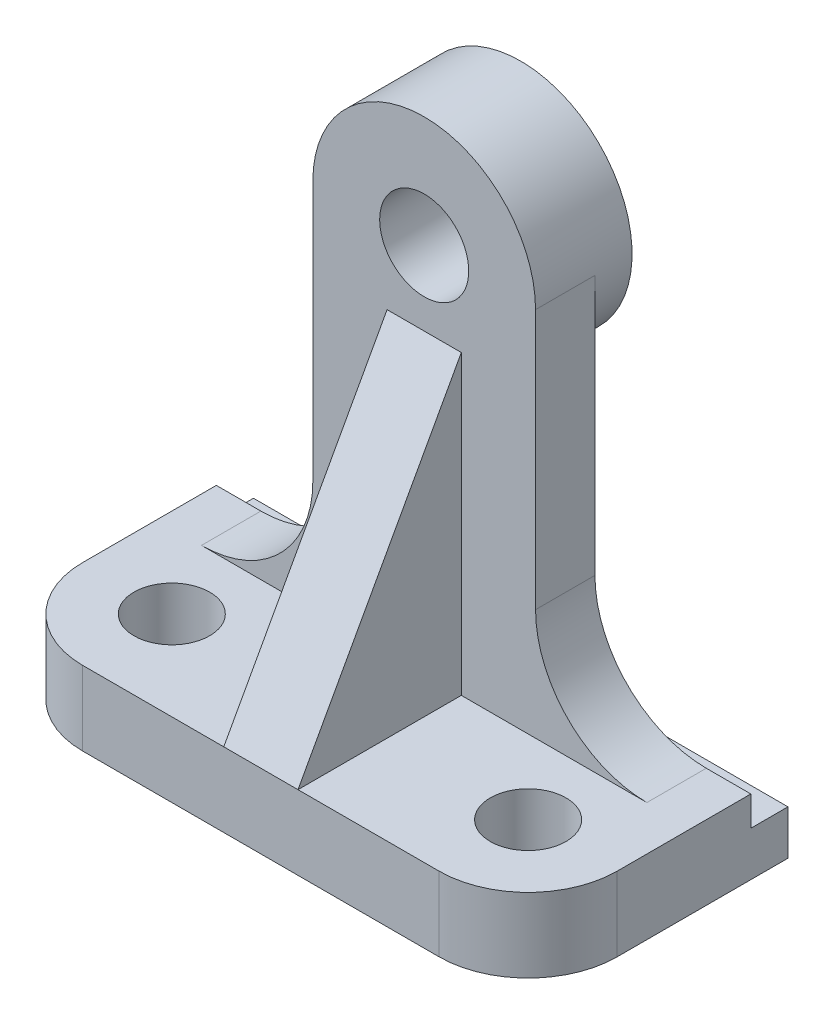
ISO-10303-21;
HEADER;
FILE_DESCRIPTION(('STEP AP214'),'2;1');
FILE_NAME('part.step','',(''),(''),'','','');
FILE_SCHEMA(('AUTOMOTIVE_DESIGN { 1 0 10303 214 1 1 1 1 }'));
ENDSEC;
DATA;
#1=APPLICATION_CONTEXT('core data for automotive mechanical design processes');
#2=APPLICATION_PROTOCOL_DEFINITION('international standard','automotive_design',2000,#1);
#3=PRODUCT_CONTEXT('',#1,'mechanical');
#4=PRODUCT('Part','Part','',(#3));
#5=PRODUCT_RELATED_PRODUCT_CATEGORY('part','',(#4));
#6=PRODUCT_DEFINITION_FORMATION('','',#4);
#7=PRODUCT_DEFINITION_CONTEXT('part definition',#1,'design');
#8=PRODUCT_DEFINITION('design','',#6,#7);
#9=PRODUCT_DEFINITION_SHAPE('','',#8);
#10=(LENGTH_UNIT() NAMED_UNIT(*) SI_UNIT(.MILLI.,.METRE.));
#11=(NAMED_UNIT(*) PLANE_ANGLE_UNIT() SI_UNIT($,.RADIAN.));
#12=(NAMED_UNIT(*) SI_UNIT($,.STERADIAN.) SOLID_ANGLE_UNIT());
#13=UNCERTAINTY_MEASURE_WITH_UNIT(LENGTH_MEASURE(1.E-05),#10,'distance_accuracy_value','');
#14=(GEOMETRIC_REPRESENTATION_CONTEXT(3) GLOBAL_UNCERTAINTY_ASSIGNED_CONTEXT((#13)) GLOBAL_UNIT_ASSIGNED_CONTEXT((#10,
#11,#12)) REPRESENTATION_CONTEXT('',''));
#15=CARTESIAN_POINT('',(0.,0.,0.));
#16=DIRECTION('',(0.,0.,1.));
#17=DIRECTION('',(1.,0.,0.));
#18=AXIS2_PLACEMENT_3D('',#15,#16,#17);
#19=CARTESIAN_POINT('',(24.,10.,5.5));
#20=DIRECTION('',(0.,-1.,0.));
#21=DIRECTION('',(0.,0.,-1.));
#22=AXIS2_PLACEMENT_3D('',#19,#20,#21);
#23=PLANE('',#22);
#24=CARTESIAN_POINT('',(-24.,10.,5.50000000000001));
#25=DIRECTION('',(0.,1.,0.));
#26=DIRECTION('',(0.,0.,1.));
#27=AXIS2_PLACEMENT_3D('',#24,#25,#26);
#28=CIRCLE('',#27,5.1);
#29=CARTESIAN_POINT('',(-24.,10.,10.6));
#30=VERTEX_POINT('',#29);
#31=EDGE_CURVE('E272',#30,#30,#28,.T.);
#32=ORIENTED_EDGE('',*,*,#31,.F.);
#33=EDGE_LOOP('',(#32));
#34=FACE_BOUND('',#33,.T.);
#35=DIRECTION('',(0.,0.,1.));
#36=VECTOR('',#35,1.);
#37=CARTESIAN_POINT('',(-5.,10.,5.5));
#38=LINE('',#37,#36);
#39=CARTESIAN_POINT('',(-5.,10.,-4.5));
#40=VERTEX_POINT('',#39);
#41=CARTESIAN_POINT('',(-5.,10.,17.5));
#42=VERTEX_POINT('',#41);
#43=EDGE_CURVE('E178',#40,#42,#38,.T.);
#44=ORIENTED_EDGE('',*,*,#43,.F.);
#45=DIRECTION('',(-1.,0.,0.));
#46=VECTOR('',#45,1.);
#47=CARTESIAN_POINT('',(30.0000000000001,10.,-4.5));
#48=LINE('',#47,#46);
#49=CARTESIAN_POINT('',(-30.0000000000001,10.,-4.5));
#50=VERTEX_POINT('',#49);
#51=EDGE_CURVE('E162',#40,#50,#48,.T.);
#52=ORIENTED_EDGE('',*,*,#51,.T.);
#53=DIRECTION('',(0.,0.,-1.));
#54=VECTOR('',#53,1.);
#55=CARTESIAN_POINT('',(-30.0000000000001,10.,-4.5));
#56=LINE('',#55,#54);
#57=CARTESIAN_POINT('',(-30.0000000000001,10.,-12.5));
#58=VERTEX_POINT('',#57);
#59=EDGE_CURVE('E238',#50,#58,#56,.T.);
#60=ORIENTED_EDGE('',*,*,#59,.T.);
#61=DIRECTION('',(-1.,0.,0.));
#62=VECTOR('',#61,1.);
#63=CARTESIAN_POINT('',(36.,10.,-12.5));
#64=LINE('',#63,#62);
#65=CARTESIAN_POINT('',(-36.,10.,-12.5));
#66=VERTEX_POINT('',#65);
#67=EDGE_CURVE('E262',#58,#66,#64,.T.);
#68=ORIENTED_EDGE('',*,*,#67,.T.);
#69=DIRECTION('',(0.,0.,1.));
#70=VECTOR('',#69,1.);
#71=CARTESIAN_POINT('',(-36.,10.,-17.5));
#72=LINE('',#71,#70);
#73=CARTESIAN_POINT('',(-36.,10.,5.49999999999992));
#74=VERTEX_POINT('',#73);
#75=EDGE_CURVE('E281',#66,#74,#72,.T.);
#76=ORIENTED_EDGE('',*,*,#75,.T.);
#77=CARTESIAN_POINT('',(-24.,10.,5.50000000000001));
#78=DIRECTION('',(0.,1.,0.));
#79=DIRECTION('',(0.,0.,-1.));
#80=AXIS2_PLACEMENT_3D('',#77,#78,#79);
#81=CIRCLE('',#80,12.);
#82=CARTESIAN_POINT('',(-23.9999999999999,10.,17.5));
#83=VERTEX_POINT('',#82);
#84=EDGE_CURVE('E284',#74,#83,#81,.T.);
#85=ORIENTED_EDGE('',*,*,#84,.T.);
#86=DIRECTION('',(1.,0.,0.));
#87=VECTOR('',#86,1.);
#88=CARTESIAN_POINT('',(23.9999999999999,10.,17.5));
#89=LINE('',#88,#87);
#90=EDGE_CURVE('E179',#83,#42,#89,.T.);
#91=ORIENTED_EDGE('',*,*,#90,.T.);
#92=EDGE_LOOP('',(#44,#52,#60,#68,#76,#85,#91));
#93=FACE_BOUND('',#92,.T.);
#94=ADVANCED_FACE('F43',(#34,#93),#23,.F.);
#95=CARTESIAN_POINT('',(36.,10.,-12.5));
#96=DIRECTION('',(0.,0.,1.));
#97=DIRECTION('',(1.,0.,0.));
#98=AXIS2_PLACEMENT_3D('',#95,#96,#97);
#99=PLANE('',#98);
#100=DIRECTION('',(-1.,0.,0.));
#101=VECTOR('',#100,1.);
#102=CARTESIAN_POINT('',(36.,6.,-12.5));
#103=LINE('',#102,#101);
#104=CARTESIAN_POINT('',(36.,6.,-12.5));
#105=VERTEX_POINT('',#104);
#106=CARTESIAN_POINT('',(-36.,6.,-12.5));
#107=VERTEX_POINT('',#106);
#108=EDGE_CURVE('E263',#105,#107,#103,.T.);
#109=ORIENTED_EDGE('',*,*,#108,.T.);
#110=DIRECTION('',(0.,1.,0.));
#111=VECTOR('',#110,1.);
#112=CARTESIAN_POINT('',(-36.,10.,-12.5));
#113=LINE('',#112,#111);
#114=EDGE_CURVE('E251',#107,#66,#113,.T.);
#115=ORIENTED_EDGE('',*,*,#114,.T.);
#116=ORIENTED_EDGE('',*,*,#67,.F.);
#117=CARTESIAN_POINT('',(-30.,25.,-12.5));
#118=DIRECTION('',(0.,0.,1.));
#119=DIRECTION('',(-1.,0.,0.));
#120=AXIS2_PLACEMENT_3D('',#117,#118,#119);
#121=CIRCLE('',#120,15.);
#122=CARTESIAN_POINT('',(-15.,25.0000000000001,-12.5));
#123=VERTEX_POINT('',#122);
#124=EDGE_CURVE('E227',#58,#123,#121,.T.);
#125=ORIENTED_EDGE('',*,*,#124,.T.);
#126=DIRECTION('',(0.,1.,0.));
#127=VECTOR('',#126,1.);
#128=CARTESIAN_POINT('',(-15.,60.,-12.5));
#129=LINE('',#128,#127);
#130=CARTESIAN_POINT('',(-15.,60.,-12.5));
#131=VERTEX_POINT('',#130);
#132=EDGE_CURVE('E212',#123,#131,#129,.T.);
#133=ORIENTED_EDGE('',*,*,#132,.T.);
#134=CARTESIAN_POINT('',(0.,60.,-12.5));
#135=DIRECTION('',(0.,0.,-1.));
#136=DIRECTION('',(-1.,0.,0.));
#137=AXIS2_PLACEMENT_3D('',#134,#135,#136);
#138=CIRCLE('',#137,15.);
#139=CARTESIAN_POINT('',(15.,60.,-12.5));
#140=VERTEX_POINT('',#139);
#141=EDGE_CURVE('E196',#140,#131,#138,.T.);
#142=ORIENTED_EDGE('',*,*,#141,.F.);
#143=DIRECTION('',(0.,-1.,0.));
#144=VECTOR('',#143,1.);
#145=CARTESIAN_POINT('',(15.,60.,-12.5));
#146=LINE('',#145,#144);
#147=CARTESIAN_POINT('',(15.,25.0000000000001,-12.5));
#148=VERTEX_POINT('',#147);
#149=EDGE_CURVE('E207',#140,#148,#146,.T.);
#150=ORIENTED_EDGE('',*,*,#149,.T.);
#151=CARTESIAN_POINT('',(30.,25.,-12.5));
#152=DIRECTION('',(0.,0.,1.));
#153=DIRECTION('',(1.,0.,0.));
#154=AXIS2_PLACEMENT_3D('',#151,#152,#153);
#155=CIRCLE('',#154,15.);
#156=CARTESIAN_POINT('',(30.,10.,-12.5));
#157=VERTEX_POINT('',#156);
#158=EDGE_CURVE('E224',#148,#157,#155,.T.);
#159=ORIENTED_EDGE('',*,*,#158,.T.);
#160=CARTESIAN_POINT('',(36.,10.,-12.5));
#161=VERTEX_POINT('',#160);
#162=EDGE_CURVE('E259',#161,#157,#64,.T.);
#163=ORIENTED_EDGE('',*,*,#162,.F.);
#164=DIRECTION('',(0.,1.,0.));
#165=VECTOR('',#164,1.);
#166=CARTESIAN_POINT('',(36.,10.,-12.5));
#167=LINE('',#166,#165);
#168=EDGE_CURVE('E250',#105,#161,#167,.T.);
#169=ORIENTED_EDGE('',*,*,#168,.F.);
#170=EDGE_LOOP('',(#109,#115,#116,#125,#133,#142,#150,#159,#163,#169));
#171=FACE_BOUND('',#170,.T.);
#172=ADVANCED_FACE('F360',(#171),#99,.F.);
#173=CARTESIAN_POINT('',(24.,10.,5.5));
#174=DIRECTION('',(0.,1.,0.));
#175=DIRECTION('',(0.,0.,1.));
#176=AXIS2_PLACEMENT_3D('',#173,#174,#175);
#177=CIRCLE('',#176,5.1);
#178=CARTESIAN_POINT('',(24.,10.,10.6));
#179=VERTEX_POINT('',#178);
#180=EDGE_CURVE('E266',#179,#179,#177,.T.);
#181=ORIENTED_EDGE('',*,*,#180,.F.);
#182=EDGE_LOOP('',(#181));
#183=FACE_BOUND('',#182,.T.);
#184=CARTESIAN_POINT('',(30.0000000000001,10.,-4.5));
#185=VERTEX_POINT('',#184);
#186=CARTESIAN_POINT('',(5.,10.,-4.5));
#187=VERTEX_POINT('',#186);
#188=EDGE_CURVE('E174',#185,#187,#48,.T.);
#189=ORIENTED_EDGE('',*,*,#188,.T.);
#190=DIRECTION('',(0.,0.,1.));
#191=VECTOR('',#190,1.);
#192=CARTESIAN_POINT('',(5.,10.,5.5));
#193=LINE('',#192,#191);
#194=CARTESIAN_POINT('',(5.,10.,17.5));
#195=VERTEX_POINT('',#194);
#196=EDGE_CURVE('E58',#187,#195,#193,.T.);
#197=ORIENTED_EDGE('',*,*,#196,.T.);
#198=CARTESIAN_POINT('',(23.9999999999999,10.,17.5));
#199=VERTEX_POINT('',#198);
#200=EDGE_CURVE('E286',#195,#199,#89,.T.);
#201=ORIENTED_EDGE('',*,*,#200,.T.);
#202=CARTESIAN_POINT('',(24.,10.,5.5));
#203=DIRECTION('',(0.,1.,0.));
#204=DIRECTION('',(0.,0.,-1.));
#205=AXIS2_PLACEMENT_3D('',#202,#203,#204);
#206=CIRCLE('',#205,12.);
#207=CARTESIAN_POINT('',(36.,10.,5.49999999999991));
#208=VERTEX_POINT('',#207);
#209=EDGE_CURVE('E288',#199,#208,#206,.T.);
#210=ORIENTED_EDGE('',*,*,#209,.T.);
#211=DIRECTION('',(0.,0.,-1.));
#212=VECTOR('',#211,1.);
#213=CARTESIAN_POINT('',(36.,10.,-17.5));
#214=LINE('',#213,#212);
#215=EDGE_CURVE('E278',#208,#161,#214,.T.);
#216=ORIENTED_EDGE('',*,*,#215,.T.);
#217=ORIENTED_EDGE('',*,*,#162,.T.);
#218=DIRECTION('',(0.,0.,-1.));
#219=VECTOR('',#218,1.);
#220=CARTESIAN_POINT('',(30.0000000000001,10.,-4.5));
#221=LINE('',#220,#219);
#222=EDGE_CURVE('E240',#185,#157,#221,.T.);
#223=ORIENTED_EDGE('',*,*,#222,.F.);
#224=EDGE_LOOP('',(#189,#197,#201,#210,#216,#217,#223));
#225=FACE_BOUND('',#224,.T.);
#226=ADVANCED_FACE('F345',(#183,#225),#23,.F.);
#227=CARTESIAN_POINT('',(24.,0.,5.5));
#228=DIRECTION('',(0.,-1.,0.));
#229=DIRECTION('',(0.,0.,-1.));
#230=AXIS2_PLACEMENT_3D('',#227,#228,#229);
#231=PLANE('',#230);
#232=CARTESIAN_POINT('',(24.,0.,5.5));
#233=DIRECTION('',(0.,1.,0.));
#234=DIRECTION('',(0.,0.,-1.));
#235=AXIS2_PLACEMENT_3D('',#232,#233,#234);
#236=CIRCLE('',#235,12.);
#237=CARTESIAN_POINT('',(23.9999999999999,0.,17.5));
#238=VERTEX_POINT('',#237);
#239=CARTESIAN_POINT('',(36.,0.,5.49999999999991));
#240=VERTEX_POINT('',#239);
#241=EDGE_CURVE('E282',#238,#240,#236,.T.);
#242=ORIENTED_EDGE('',*,*,#241,.F.);
#243=DIRECTION('',(1.,0.,0.));
#244=VECTOR('',#243,1.);
#245=CARTESIAN_POINT('',(23.9999999999999,0.,17.5));
#246=LINE('',#245,#244);
#247=CARTESIAN_POINT('',(-23.9999999999999,0.,17.5));
#248=VERTEX_POINT('',#247);
#249=EDGE_CURVE('E299',#248,#238,#246,.T.);
#250=ORIENTED_EDGE('',*,*,#249,.F.);
#251=CARTESIAN_POINT('',(-24.,0.,5.50000000000001));
#252=DIRECTION('',(0.,1.,0.));
#253=DIRECTION('',(0.,0.,-1.));
#254=AXIS2_PLACEMENT_3D('',#251,#252,#253);
#255=CIRCLE('',#254,12.);
#256=CARTESIAN_POINT('',(-36.,0.,5.49999999999992));
#257=VERTEX_POINT('',#256);
#258=EDGE_CURVE('E297',#257,#248,#255,.T.);
#259=ORIENTED_EDGE('',*,*,#258,.F.);
#260=DIRECTION('',(0.,0.,1.));
#261=VECTOR('',#260,1.);
#262=CARTESIAN_POINT('',(-36.,0.,-17.5));
#263=LINE('',#262,#261);
#264=CARTESIAN_POINT('',(-36.,0.,-17.5));
#265=VERTEX_POINT('',#264);
#266=EDGE_CURVE('E295',#265,#257,#263,.T.);
#267=ORIENTED_EDGE('',*,*,#266,.F.);
#268=DIRECTION('',(-1.,0.,0.));
#269=VECTOR('',#268,1.);
#270=CARTESIAN_POINT('',(36.,0.,-17.5));
#271=LINE('',#270,#269);
#272=CARTESIAN_POINT('',(36.,0.,-17.5));
#273=VERTEX_POINT('',#272);
#274=EDGE_CURVE('E293',#273,#265,#271,.T.);
#275=ORIENTED_EDGE('',*,*,#274,.F.);
#276=DIRECTION('',(0.,0.,-1.));
#277=VECTOR('',#276,1.);
#278=CARTESIAN_POINT('',(36.,0.,-17.5));
#279=LINE('',#278,#277);
#280=EDGE_CURVE('E275',#240,#273,#279,.T.);
#281=ORIENTED_EDGE('',*,*,#280,.F.);
#282=EDGE_LOOP('',(#242,#250,#259,#267,#275,#281));
#283=FACE_BOUND('',#282,.T.);
#284=CARTESIAN_POINT('',(24.,0.,5.5));
#285=DIRECTION('',(0.,1.,0.));
#286=DIRECTION('',(0.,0.,1.));
#287=AXIS2_PLACEMENT_3D('',#284,#285,#286);
#288=CIRCLE('',#287,5.1);
#289=CARTESIAN_POINT('',(24.,0.,10.6));
#290=VERTEX_POINT('',#289);
#291=EDGE_CURVE('E261',#290,#290,#288,.T.);
#292=ORIENTED_EDGE('',*,*,#291,.T.);
#293=EDGE_LOOP('',(#292));
#294=FACE_BOUND('',#293,.T.);
#295=CARTESIAN_POINT('',(-24.,0.,5.50000000000001));
#296=DIRECTION('',(0.,1.,0.));
#297=DIRECTION('',(0.,0.,1.));
#298=AXIS2_PLACEMENT_3D('',#295,#296,#297);
#299=CIRCLE('',#298,5.1);
#300=CARTESIAN_POINT('',(-24.,0.,10.6));
#301=VERTEX_POINT('',#300);
#302=EDGE_CURVE('E269',#301,#301,#299,.T.);
#303=ORIENTED_EDGE('',*,*,#302,.T.);
#304=EDGE_LOOP('',(#303));
#305=FACE_BOUND('',#304,.T.);
#306=ADVANCED_FACE('F327',(#283,#294,#305),#231,.T.);
#307=CARTESIAN_POINT('',(36.,10.,-17.5));
#308=DIRECTION('',(-1.,0.,0.));
#309=DIRECTION('',(0.,0.,1.));
#310=AXIS2_PLACEMENT_3D('',#307,#308,#309);
#311=PLANE('',#310);
#312=DIRECTION('',(0.,0.,1.));
#313=VECTOR('',#312,1.);
#314=CARTESIAN_POINT('',(36.,6.,-17.5));
#315=LINE('',#314,#313);
#316=CARTESIAN_POINT('',(36.,6.,-17.5));
#317=VERTEX_POINT('',#316);
#318=EDGE_CURVE('E247',#317,#105,#315,.T.);
#319=ORIENTED_EDGE('',*,*,#318,.T.);
#320=ORIENTED_EDGE('',*,*,#168,.T.);
#321=ORIENTED_EDGE('',*,*,#215,.F.);
#322=DIRECTION('',(0.,-1.,0.));
#323=VECTOR('',#322,1.);
#324=CARTESIAN_POINT('',(36.,10.,5.49999999999991));
#325=LINE('',#324,#323);
#326=EDGE_CURVE('E290',#208,#240,#325,.T.);
#327=ORIENTED_EDGE('',*,*,#326,.T.);
#328=ORIENTED_EDGE('',*,*,#280,.T.);
#329=DIRECTION('',(0.,-1.,0.));
#330=VECTOR('',#329,1.);
#331=CARTESIAN_POINT('',(36.,10.,-17.5));
#332=LINE('',#331,#330);
#333=EDGE_CURVE('E11',#317,#273,#332,.T.);
#334=ORIENTED_EDGE('',*,*,#333,.F.);
#335=EDGE_LOOP('',(#319,#320,#321,#327,#328,#334));
#336=FACE_BOUND('',#335,.T.);
#337=ADVANCED_FACE('F45',(#336),#311,.F.);
#338=CARTESIAN_POINT('',(36.,10.,-17.5));
#339=DIRECTION('',(0.,0.,1.));
#340=DIRECTION('',(1.,0.,0.));
#341=AXIS2_PLACEMENT_3D('',#338,#339,#340);
#342=PLANE('',#341);
#343=ORIENTED_EDGE('',*,*,#274,.T.);
#344=DIRECTION('',(0.,-1.,0.));
#345=VECTOR('',#344,1.);
#346=CARTESIAN_POINT('',(-36.,10.,-17.5));
#347=LINE('',#346,#345);
#348=CARTESIAN_POINT('',(-36.,6.,-17.5));
#349=VERTEX_POINT('',#348);
#350=EDGE_CURVE('E51',#349,#265,#347,.T.);
#351=ORIENTED_EDGE('',*,*,#350,.F.);
#352=DIRECTION('',(-1.,0.,0.));
#353=VECTOR('',#352,1.);
#354=CARTESIAN_POINT('',(36.,6.,-17.5));
#355=LINE('',#354,#353);
#356=EDGE_CURVE('E254',#317,#349,#355,.T.);
#357=ORIENTED_EDGE('',*,*,#356,.F.);
#358=ORIENTED_EDGE('',*,*,#333,.T.);
#359=EDGE_LOOP('',(#343,#351,#357,#358));
#360=FACE_BOUND('',#359,.T.);
#361=ADVANCED_FACE('F377',(#360),#342,.F.);
#362=CARTESIAN_POINT('',(-36.,10.,-17.5));
#363=DIRECTION('',(1.,0.,0.));
#364=DIRECTION('',(0.,0.,-1.));
#365=AXIS2_PLACEMENT_3D('',#362,#363,#364);
#366=PLANE('',#365);
#367=ORIENTED_EDGE('',*,*,#75,.F.);
#368=ORIENTED_EDGE('',*,*,#114,.F.);
#369=DIRECTION('',(0.,0.,1.));
#370=VECTOR('',#369,1.);
#371=CARTESIAN_POINT('',(-36.,6.,-17.5));
#372=LINE('',#371,#370);
#373=EDGE_CURVE('E235',#349,#107,#372,.T.);
#374=ORIENTED_EDGE('',*,*,#373,.F.);
#375=ORIENTED_EDGE('',*,*,#350,.T.);
#376=ORIENTED_EDGE('',*,*,#266,.T.);
#377=DIRECTION('',(0.,-1.,0.));
#378=VECTOR('',#377,1.);
#379=CARTESIAN_POINT('',(-36.,10.,5.49999999999992));
#380=LINE('',#379,#378);
#381=EDGE_CURVE('E310',#74,#257,#380,.T.);
#382=ORIENTED_EDGE('',*,*,#381,.F.);
#383=EDGE_LOOP('',(#367,#368,#374,#375,#376,#382));
#384=FACE_BOUND('',#383,.T.);
#385=ADVANCED_FACE('F318',(#384),#366,.F.);
#386=CARTESIAN_POINT('',(-24.,10.,5.50000000000001));
#387=DIRECTION('',(0.,-1.,0.));
#388=DIRECTION('',(0.,0.,-1.));
#389=AXIS2_PLACEMENT_3D('',#386,#387,#388);
#390=CYLINDRICAL_SURFACE('',#389,12.);
#391=ORIENTED_EDGE('',*,*,#258,.T.);
#392=DIRECTION('',(0.,-1.,0.));
#393=VECTOR('',#392,1.);
#394=CARTESIAN_POINT('',(-23.9999999999999,10.,17.5));
#395=LINE('',#394,#393);
#396=EDGE_CURVE('E307',#83,#248,#395,.T.);
#397=ORIENTED_EDGE('',*,*,#396,.F.);
#398=ORIENTED_EDGE('',*,*,#84,.F.);
#399=ORIENTED_EDGE('',*,*,#381,.T.);
#400=EDGE_LOOP('',(#391,#397,#398,#399));
#401=FACE_BOUND('',#400,.T.);
#402=ADVANCED_FACE('F333',(#401),#390,.T.);
#403=CARTESIAN_POINT('',(23.9999999999999,10.,17.5));
#404=DIRECTION('',(0.,0.,-1.));
#405=DIRECTION('',(-1.,0.,0.));
#406=AXIS2_PLACEMENT_3D('',#403,#404,#405);
#407=PLANE('',#406);
#408=ORIENTED_EDGE('',*,*,#200,.F.);
#409=DIRECTION('',(-1.,0.,0.));
#410=VECTOR('',#409,1.);
#411=CARTESIAN_POINT('',(23.9999999999999,10.,17.5));
#412=LINE('',#411,#410);
#413=EDGE_CURVE('E65',#42,#195,#412,.F.);
#414=ORIENTED_EDGE('',*,*,#413,.F.);
#415=ORIENTED_EDGE('',*,*,#90,.F.);
#416=ORIENTED_EDGE('',*,*,#396,.T.);
#417=ORIENTED_EDGE('',*,*,#249,.T.);
#418=DIRECTION('',(0.,-1.,0.));
#419=VECTOR('',#418,1.);
#420=CARTESIAN_POINT('',(23.9999999999999,10.,17.5));
#421=LINE('',#420,#419);
#422=EDGE_CURVE('E304',#199,#238,#421,.T.);
#423=ORIENTED_EDGE('',*,*,#422,.F.);
#424=EDGE_LOOP('',(#408,#414,#415,#416,#417,#423));
#425=FACE_BOUND('',#424,.T.);
#426=ADVANCED_FACE('F335',(#425),#407,.F.);
#427=CARTESIAN_POINT('',(24.,10.,5.5));
#428=DIRECTION('',(0.,-1.,0.));
#429=DIRECTION('',(0.,0.,-1.));
#430=AXIS2_PLACEMENT_3D('',#427,#428,#429);
#431=CYLINDRICAL_SURFACE('',#430,12.);
#432=ORIENTED_EDGE('',*,*,#241,.T.);
#433=ORIENTED_EDGE('',*,*,#326,.F.);
#434=ORIENTED_EDGE('',*,*,#209,.F.);
#435=ORIENTED_EDGE('',*,*,#422,.T.);
#436=EDGE_LOOP('',(#432,#433,#434,#435));
#437=FACE_BOUND('',#436,.T.);
#438=ADVANCED_FACE('F339',(#437),#431,.T.);
#439=CARTESIAN_POINT('',(-24.,10.,5.50000000000001));
#440=DIRECTION('',(0.,-1.,0.));
#441=DIRECTION('',(0.,0.,-1.));
#442=AXIS2_PLACEMENT_3D('',#439,#440,#441);
#443=CYLINDRICAL_SURFACE('',#442,5.1);
#444=ORIENTED_EDGE('',*,*,#31,.T.);
#445=EDGE_LOOP('',(#444));
#446=FACE_BOUND('',#445,.T.);
#447=ORIENTED_EDGE('',*,*,#302,.F.);
#448=EDGE_LOOP('',(#447));
#449=FACE_BOUND('',#448,.T.);
#450=ADVANCED_FACE('F404',(#446,#449),#443,.F.);
#451=CARTESIAN_POINT('',(24.,10.,5.5));
#452=DIRECTION('',(0.,-1.,0.));
#453=DIRECTION('',(0.,0.,-1.));
#454=AXIS2_PLACEMENT_3D('',#451,#452,#453);
#455=CYLINDRICAL_SURFACE('',#454,5.1);
#456=ORIENTED_EDGE('',*,*,#180,.T.);
#457=EDGE_LOOP('',(#456));
#458=FACE_BOUND('',#457,.T.);
#459=ORIENTED_EDGE('',*,*,#291,.F.);
#460=EDGE_LOOP('',(#459));
#461=FACE_BOUND('',#460,.T.);
#462=ADVANCED_FACE('F401',(#458,#461),#455,.F.);
#463=CARTESIAN_POINT('',(36.,6.,-17.5));
#464=DIRECTION('',(0.,-1.,0.));
#465=DIRECTION('',(0.,0.,-1.));
#466=AXIS2_PLACEMENT_3D('',#463,#464,#465);
#467=PLANE('',#466);
#468=ORIENTED_EDGE('',*,*,#356,.T.);
#469=ORIENTED_EDGE('',*,*,#373,.T.);
#470=ORIENTED_EDGE('',*,*,#108,.F.);
#471=ORIENTED_EDGE('',*,*,#318,.F.);
#472=EDGE_LOOP('',(#468,#469,#470,#471));
#473=FACE_BOUND('',#472,.T.);
#474=ADVANCED_FACE('F376',(#473),#467,.F.);
#475=CARTESIAN_POINT('',(0.,60.,-4.5));
#476=DIRECTION('',(0.,0.,-1.));
#477=DIRECTION('',(-1.,0.,0.));
#478=AXIS2_PLACEMENT_3D('',#475,#476,#477);
#479=CYLINDRICAL_SURFACE('',#478,15.);
#480=ORIENTED_EDGE('',*,*,#141,.T.);
#481=DIRECTION('',(0.,0.,-1.));
#482=VECTOR('',#481,1.);
#483=CARTESIAN_POINT('',(-15.,60.,-4.5));
#484=LINE('',#483,#482);
#485=CARTESIAN_POINT('',(-15.,60.,-4.5));
#486=VERTEX_POINT('',#485);
#487=EDGE_CURVE('E232',#486,#131,#484,.T.);
#488=ORIENTED_EDGE('',*,*,#487,.F.);
#489=CARTESIAN_POINT('',(0.,60.,-4.5));
#490=DIRECTION('',(0.,0.,-1.));
#491=DIRECTION('',(-1.,0.,0.));
#492=AXIS2_PLACEMENT_3D('',#489,#490,#491);
#493=CIRCLE('',#492,15.);
#494=CARTESIAN_POINT('',(15.,60.,-4.5));
#495=VERTEX_POINT('',#494);
#496=EDGE_CURVE('E208',#486,#495,#493,.T.);
#497=ORIENTED_EDGE('',*,*,#496,.T.);
#498=DIRECTION('',(0.,0.,-1.));
#499=VECTOR('',#498,1.);
#500=CARTESIAN_POINT('',(15.,60.,-4.5));
#501=LINE('',#500,#499);
#502=EDGE_CURVE('E221',#495,#140,#501,.T.);
#503=ORIENTED_EDGE('',*,*,#502,.T.);
#504=EDGE_LOOP('',(#480,#488,#497,#503));
#505=FACE_BOUND('',#504,.T.);
#506=CARTESIAN_POINT('',(0.,60.,-17.5));
#507=DIRECTION('',(0.,0.,-1.));
#508=DIRECTION('',(-1.,0.,0.));
#509=AXIS2_PLACEMENT_3D('',#506,#507,#508);
#510=CIRCLE('',#509,15.);
#511=CARTESIAN_POINT('',(-15.,60.,-17.5));
#512=VERTEX_POINT('',#511);
#513=EDGE_CURVE('E200',#512,#512,#510,.T.);
#514=ORIENTED_EDGE('',*,*,#513,.F.);
#515=EDGE_LOOP('',(#514));
#516=FACE_BOUND('',#515,.T.);
#517=ADVANCED_FACE('F366',(#505,#516),#479,.T.);
#518=CARTESIAN_POINT('',(-15.,60.,-4.5));
#519=DIRECTION('',(-1.,0.,0.));
#520=DIRECTION('',(0.,-1.,0.));
#521=AXIS2_PLACEMENT_3D('',#518,#519,#520);
#522=PLANE('',#521);
#523=ORIENTED_EDGE('',*,*,#132,.F.);
#524=DIRECTION('',(0.,0.,-1.));
#525=VECTOR('',#524,1.);
#526=CARTESIAN_POINT('',(-15.,25.0000000000001,-4.5));
#527=LINE('',#526,#525);
#528=CARTESIAN_POINT('',(-15.,25.0000000000001,-4.5));
#529=VERTEX_POINT('',#528);
#530=EDGE_CURVE('E236',#529,#123,#527,.T.);
#531=ORIENTED_EDGE('',*,*,#530,.F.);
#532=DIRECTION('',(0.,1.,0.));
#533=VECTOR('',#532,1.);
#534=CARTESIAN_POINT('',(-15.,60.,-4.5));
#535=LINE('',#534,#533);
#536=EDGE_CURVE('E218',#529,#486,#535,.T.);
#537=ORIENTED_EDGE('',*,*,#536,.T.);
#538=ORIENTED_EDGE('',*,*,#487,.T.);
#539=EDGE_LOOP('',(#523,#531,#537,#538));
#540=FACE_BOUND('',#539,.T.);
#541=ADVANCED_FACE('F371',(#540),#522,.T.);
#542=CARTESIAN_POINT('',(-30.,25.,-4.5));
#543=DIRECTION('',(0.,0.,-1.));
#544=DIRECTION('',(-1.,0.,0.));
#545=AXIS2_PLACEMENT_3D('',#542,#543,#544);
#546=CYLINDRICAL_SURFACE('',#545,15.);
#547=ORIENTED_EDGE('',*,*,#124,.F.);
#548=ORIENTED_EDGE('',*,*,#59,.F.);
#549=CARTESIAN_POINT('',(-30.,25.,-4.5));
#550=DIRECTION('',(0.,0.,1.));
#551=DIRECTION('',(-1.,0.,0.));
#552=AXIS2_PLACEMENT_3D('',#549,#550,#551);
#553=CIRCLE('',#552,15.);
#554=EDGE_CURVE('E170',#50,#529,#553,.T.);
#555=ORIENTED_EDGE('',*,*,#554,.T.);
#556=ORIENTED_EDGE('',*,*,#530,.T.);
#557=EDGE_LOOP('',(#547,#548,#555,#556));
#558=FACE_BOUND('',#557,.T.);
#559=ADVANCED_FACE('F374',(#558),#546,.F.);
#560=CARTESIAN_POINT('',(30.,25.,-4.5));
#561=DIRECTION('',(0.,0.,-1.));
#562=DIRECTION('',(-1.,0.,0.));
#563=AXIS2_PLACEMENT_3D('',#560,#561,#562);
#564=CYLINDRICAL_SURFACE('',#563,15.);
#565=ORIENTED_EDGE('',*,*,#158,.F.);
#566=DIRECTION('',(0.,0.,-1.));
#567=VECTOR('',#566,1.);
#568=CARTESIAN_POINT('',(15.,25.0000000000001,-4.5));
#569=LINE('',#568,#567);
#570=CARTESIAN_POINT('',(15.,25.0000000000001,-4.5));
#571=VERTEX_POINT('',#570);
#572=EDGE_CURVE('E243',#571,#148,#569,.T.);
#573=ORIENTED_EDGE('',*,*,#572,.F.);
#574=CARTESIAN_POINT('',(30.,25.,-4.5));
#575=DIRECTION('',(0.,0.,1.));
#576=DIRECTION('',(1.,0.,0.));
#577=AXIS2_PLACEMENT_3D('',#574,#575,#576);
#578=CIRCLE('',#577,15.);
#579=EDGE_CURVE('E175',#571,#185,#578,.T.);
#580=ORIENTED_EDGE('',*,*,#579,.T.);
#581=ORIENTED_EDGE('',*,*,#222,.T.);
#582=EDGE_LOOP('',(#565,#573,#580,#581));
#583=FACE_BOUND('',#582,.T.);
#584=ADVANCED_FACE('F358',(#583),#564,.F.);
#585=CARTESIAN_POINT('',(15.,60.,-4.5));
#586=DIRECTION('',(1.,0.,0.));
#587=DIRECTION('',(0.,1.,0.));
#588=AXIS2_PLACEMENT_3D('',#585,#586,#587);
#589=PLANE('',#588);
#590=ORIENTED_EDGE('',*,*,#149,.F.);
#591=ORIENTED_EDGE('',*,*,#502,.F.);
#592=DIRECTION('',(0.,-1.,0.));
#593=VECTOR('',#592,1.);
#594=CARTESIAN_POINT('',(15.,60.,-4.5));
#595=LINE('',#594,#593);
#596=EDGE_CURVE('E211',#495,#571,#595,.T.);
#597=ORIENTED_EDGE('',*,*,#596,.T.);
#598=ORIENTED_EDGE('',*,*,#572,.T.);
#599=EDGE_LOOP('',(#590,#591,#597,#598));
#600=FACE_BOUND('',#599,.T.);
#601=ADVANCED_FACE('F363',(#600),#589,.T.);
#602=CARTESIAN_POINT('',(0.,60.,-4.5));
#603=DIRECTION('',(0.,0.,-1.));
#604=DIRECTION('',(-1.,0.,0.));
#605=AXIS2_PLACEMENT_3D('',#602,#603,#604);
#606=PLANE('',#605);
#607=CARTESIAN_POINT('',(0.,60.,-4.5));
#608=DIRECTION('',(0.,0.,-1.));
#609=DIRECTION('',(-1.,0.,0.));
#610=AXIS2_PLACEMENT_3D('',#607,#608,#609);
#611=CIRCLE('',#610,6.);
#612=CARTESIAN_POINT('',(-6.,60.,-4.5));
#613=VERTEX_POINT('',#612);
#614=EDGE_CURVE('E203',#613,#613,#611,.T.);
#615=ORIENTED_EDGE('',*,*,#614,.T.);
#616=EDGE_LOOP('',(#615));
#617=FACE_BOUND('',#616,.T.);
#618=DIRECTION('',(-1.,0.,0.));
#619=VECTOR('',#618,1.);
#620=CARTESIAN_POINT('',(0.,50.,-4.5));
#621=LINE('',#620,#619);
#622=CARTESIAN_POINT('',(-5.,50.,-4.5));
#623=VERTEX_POINT('',#622);
#624=CARTESIAN_POINT('',(5.,50.,-4.5));
#625=VERTEX_POINT('',#624);
#626=EDGE_CURVE('E193',#623,#625,#621,.F.);
#627=ORIENTED_EDGE('',*,*,#626,.T.);
#628=DIRECTION('',(0.,-1.,0.));
#629=VECTOR('',#628,1.);
#630=CARTESIAN_POINT('',(5.,60.,-4.5));
#631=LINE('',#630,#629);
#632=EDGE_CURVE('E188',#625,#187,#631,.T.);
#633=ORIENTED_EDGE('',*,*,#632,.T.);
#634=ORIENTED_EDGE('',*,*,#188,.F.);
#635=ORIENTED_EDGE('',*,*,#579,.F.);
#636=ORIENTED_EDGE('',*,*,#596,.F.);
#637=ORIENTED_EDGE('',*,*,#496,.F.);
#638=ORIENTED_EDGE('',*,*,#536,.F.);
#639=ORIENTED_EDGE('',*,*,#554,.F.);
#640=ORIENTED_EDGE('',*,*,#51,.F.);
#641=DIRECTION('',(0.,-1.,0.));
#642=VECTOR('',#641,1.);
#643=CARTESIAN_POINT('',(-5.,60.,-4.5));
#644=LINE('',#643,#642);
#645=EDGE_CURVE('E166',#623,#40,#644,.T.);
#646=ORIENTED_EDGE('',*,*,#645,.F.);
#647=EDGE_LOOP('',(#627,#633,#634,#635,#636,#637,#638,#639,#640,#646));
#648=FACE_BOUND('',#647,.T.);
#649=ADVANCED_FACE('F164',(#617,#648),#606,.F.);
#650=CARTESIAN_POINT('',(0.,60.,-4.5));
#651=DIRECTION('',(0.,0.,-1.));
#652=DIRECTION('',(-1.,0.,0.));
#653=AXIS2_PLACEMENT_3D('',#650,#651,#652);
#654=CYLINDRICAL_SURFACE('',#653,6.);
#655=CARTESIAN_POINT('',(0.,60.,-17.5));
#656=DIRECTION('',(0.,0.,-1.));
#657=DIRECTION('',(-1.,0.,0.));
#658=AXIS2_PLACEMENT_3D('',#655,#656,#657);
#659=CIRCLE('',#658,6.);
#660=CARTESIAN_POINT('',(-6.,60.,-17.5));
#661=VERTEX_POINT('',#660);
#662=EDGE_CURVE('E197',#661,#661,#659,.F.);
#663=ORIENTED_EDGE('',*,*,#662,.F.);
#664=EDGE_LOOP('',(#663));
#665=FACE_BOUND('',#664,.T.);
#666=ORIENTED_EDGE('',*,*,#614,.F.);
#667=EDGE_LOOP('',(#666));
#668=FACE_BOUND('',#667,.T.);
#669=ADVANCED_FACE('F431',(#665,#668),#654,.F.);
#670=CARTESIAN_POINT('',(0.,0.,-17.5));
#671=DIRECTION('',(0.,0.,-1.));
#672=DIRECTION('',(-1.,0.,0.));
#673=AXIS2_PLACEMENT_3D('',#670,#671,#672);
#674=PLANE('',#673);
#675=ORIENTED_EDGE('',*,*,#662,.T.);
#676=EDGE_LOOP('',(#675));
#677=FACE_BOUND('',#676,.T.);
#678=ORIENTED_EDGE('',*,*,#513,.T.);
#679=EDGE_LOOP('',(#678));
#680=FACE_BOUND('',#679,.T.);
#681=ADVANCED_FACE('F435',(#677,#680),#674,.T.);
#682=CARTESIAN_POINT('',(0.,10.,17.5));
#683=DIRECTION('',(0.,-0.481918749772156,-0.876215908676647));
#684=DIRECTION('',(0.,0.876215908676647,-0.481918749772156));
#685=AXIS2_PLACEMENT_3D('',#682,#683,#684);
#686=PLANE('',#685);
#687=DIRECTION('',(0.,0.876215908676647,-0.481918749772156));
#688=VECTOR('',#687,1.);
#689=CARTESIAN_POINT('',(-5.,10.,17.5));
#690=LINE('',#689,#688);
#691=EDGE_CURVE('E186',#42,#623,#690,.T.);
#692=ORIENTED_EDGE('',*,*,#691,.F.);
#693=ORIENTED_EDGE('',*,*,#413,.T.);
#694=DIRECTION('',(0.,0.876215908676647,-0.481918749772156));
#695=VECTOR('',#694,1.);
#696=CARTESIAN_POINT('',(5.,10.,17.5));
#697=LINE('',#696,#695);
#698=EDGE_CURVE('E183',#195,#625,#697,.T.);
#699=ORIENTED_EDGE('',*,*,#698,.T.);
#700=ORIENTED_EDGE('',*,*,#626,.F.);
#701=EDGE_LOOP('',(#692,#693,#699,#700));
#702=FACE_BOUND('',#701,.T.);
#703=ADVANCED_FACE('F349',(#702),#686,.F.);
#704=CARTESIAN_POINT('',(5.,37.5,0.));
#705=DIRECTION('',(1.,0.,0.));
#706=DIRECTION('',(0.,0.,-1.));
#707=AXIS2_PLACEMENT_3D('',#704,#705,#706);
#708=PLANE('',#707);
#709=ORIENTED_EDGE('',*,*,#632,.F.);
#710=ORIENTED_EDGE('',*,*,#698,.F.);
#711=ORIENTED_EDGE('',*,*,#196,.F.);
#712=EDGE_LOOP('',(#709,#710,#711));
#713=FACE_BOUND('',#712,.T.);
#714=ADVANCED_FACE('F352',(#713),#708,.T.);
#715=CARTESIAN_POINT('',(-5.,37.5,0.));
#716=DIRECTION('',(1.,0.,0.));
#717=DIRECTION('',(0.,0.,-1.));
#718=AXIS2_PLACEMENT_3D('',#715,#716,#717);
#719=PLANE('',#718);
#720=ORIENTED_EDGE('',*,*,#691,.T.);
#721=ORIENTED_EDGE('',*,*,#645,.T.);
#722=ORIENTED_EDGE('',*,*,#43,.T.);
#723=EDGE_LOOP('',(#720,#721,#722));
#724=FACE_BOUND('',#723,.T.);
#725=ADVANCED_FACE('F185',(#724),#719,.F.);
#726=CLOSED_SHELL('',(#94,#172,#226,#306,#337,#361,#385,#402,#426,#438,#450,#462,#474,#517,#541,
#559,#584,#601,#649,#669,#681,#703,#714,#725));
#727=MANIFOLD_SOLID_BREP('B2',#726);
#728=ADVANCED_BREP_SHAPE_REPRESENTATION('',(#18,#727),#14);
#729=SHAPE_DEFINITION_REPRESENTATION(#9,#728);
ENDSEC;
END-ISO-10303-21;
